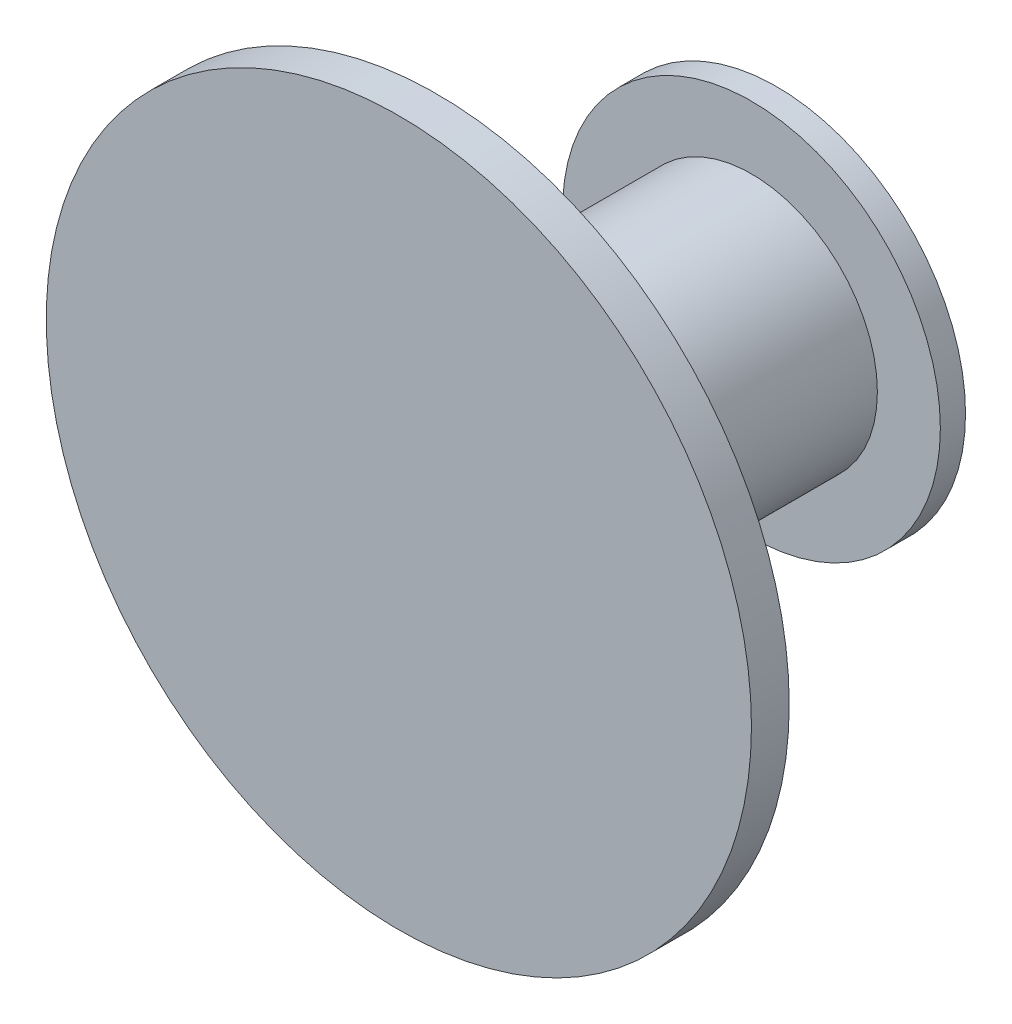
ISO-10303-21;
HEADER;
FILE_DESCRIPTION(('STEP AP214'),'2;1');
FILE_NAME('part.step','',(''),(''),'','','');
FILE_SCHEMA(('AUTOMOTIVE_DESIGN { 1 0 10303 214 1 1 1 1 }'));
ENDSEC;
DATA;
#1=APPLICATION_CONTEXT('core data for automotive mechanical design processes');
#2=APPLICATION_PROTOCOL_DEFINITION('international standard','automotive_design',2000,#1);
#3=PRODUCT_CONTEXT('',#1,'mechanical');
#4=PRODUCT('Part','Part','',(#3));
#5=PRODUCT_RELATED_PRODUCT_CATEGORY('part','',(#4));
#6=PRODUCT_DEFINITION_FORMATION('','',#4);
#7=PRODUCT_DEFINITION_CONTEXT('part definition',#1,'design');
#8=PRODUCT_DEFINITION('design','',#6,#7);
#9=PRODUCT_DEFINITION_SHAPE('','',#8);
#10=(LENGTH_UNIT() NAMED_UNIT(*) SI_UNIT(.MILLI.,.METRE.));
#11=(NAMED_UNIT(*) PLANE_ANGLE_UNIT() SI_UNIT($,.RADIAN.));
#12=(NAMED_UNIT(*) SI_UNIT($,.STERADIAN.) SOLID_ANGLE_UNIT());
#13=UNCERTAINTY_MEASURE_WITH_UNIT(LENGTH_MEASURE(1.E-05),#10,'distance_accuracy_value','');
#14=(GEOMETRIC_REPRESENTATION_CONTEXT(3) GLOBAL_UNCERTAINTY_ASSIGNED_CONTEXT((#13)) GLOBAL_UNIT_ASSIGNED_CONTEXT((#10,
#11,#12)) REPRESENTATION_CONTEXT('',''));
#15=CARTESIAN_POINT('',(0.,0.,0.));
#16=DIRECTION('',(0.,0.,1.));
#17=DIRECTION('',(1.,0.,0.));
#18=AXIS2_PLACEMENT_3D('',#15,#16,#17);
#19=CARTESIAN_POINT('',(0.,0.,20.));
#20=DIRECTION('',(0.,0.,-1.));
#21=DIRECTION('',(-1.,0.,0.));
#22=AXIS2_PLACEMENT_3D('',#19,#20,#21);
#23=CYLINDRICAL_SURFACE('',#22,150.);
#24=CARTESIAN_POINT('',(0.,0.,20.));
#25=DIRECTION('',(0.,0.,1.));
#26=DIRECTION('',(1.,0.,0.));
#27=AXIS2_PLACEMENT_3D('',#24,#25,#26);
#28=CIRCLE('',#27,150.);
#29=CARTESIAN_POINT('',(150.,0.,20.));
#30=VERTEX_POINT('',#29);
#31=EDGE_CURVE('E45',#30,#30,#28,.T.);
#32=ORIENTED_EDGE('',*,*,#31,.F.);
#33=EDGE_LOOP('',(#32));
#34=FACE_BOUND('',#33,.T.);
#35=CARTESIAN_POINT('',(0.,0.,0.));
#36=DIRECTION('',(0.,0.,1.));
#37=DIRECTION('',(1.,0.,0.));
#38=AXIS2_PLACEMENT_3D('',#35,#36,#37);
#39=CIRCLE('',#38,150.);
#40=CARTESIAN_POINT('',(150.,0.,0.));
#41=VERTEX_POINT('',#40);
#42=EDGE_CURVE('E40',#41,#41,#39,.T.);
#43=ORIENTED_EDGE('',*,*,#42,.T.);
#44=EDGE_LOOP('',(#43));
#45=FACE_BOUND('',#44,.T.);
#46=ADVANCED_FACE('F37',(#34,#45),#23,.T.);
#47=CARTESIAN_POINT('',(0.,0.,20.));
#48=DIRECTION('',(0.,0.,1.));
#49=DIRECTION('',(1.,0.,0.));
#50=AXIS2_PLACEMENT_3D('',#47,#48,#49);
#51=PLANE('',#50);
#52=CARTESIAN_POINT('',(0.,0.,20.));
#53=DIRECTION('',(0.,0.,1.));
#54=DIRECTION('',(1.,0.,0.));
#55=AXIS2_PLACEMENT_3D('',#52,#53,#54);
#56=CIRCLE('',#55,100.);
#57=CARTESIAN_POINT('',(100.,0.,20.));
#58=VERTEX_POINT('',#57);
#59=EDGE_CURVE('E10',#58,#58,#56,.T.);
#60=ORIENTED_EDGE('',*,*,#59,.F.);
#61=EDGE_LOOP('',(#60));
#62=FACE_BOUND('',#61,.T.);
#63=ORIENTED_EDGE('',*,*,#31,.T.);
#64=EDGE_LOOP('',(#63));
#65=FACE_BOUND('',#64,.T.);
#66=ADVANCED_FACE('F83',(#62,#65),#51,.T.);
#67=CARTESIAN_POINT('',(0.,0.,0.));
#68=DIRECTION('',(0.,0.,1.));
#69=DIRECTION('',(1.,0.,0.));
#70=AXIS2_PLACEMENT_3D('',#67,#68,#69);
#71=PLANE('',#70);
#72=ORIENTED_EDGE('',*,*,#42,.F.);
#73=EDGE_LOOP('',(#72));
#74=FACE_BOUND('',#73,.T.);
#75=ADVANCED_FACE('F88',(#74),#71,.F.);
#76=CARTESIAN_POINT('',(0.,0.,270.));
#77=DIRECTION('',(0.,0.,-1.));
#78=DIRECTION('',(-1.,0.,0.));
#79=AXIS2_PLACEMENT_3D('',#76,#77,#78);
#80=CYLINDRICAL_SURFACE('',#79,100.);
#81=CARTESIAN_POINT('',(0.,0.,270.));
#82=DIRECTION('',(0.,0.,1.));
#83=DIRECTION('',(1.,0.,0.));
#84=AXIS2_PLACEMENT_3D('',#81,#82,#83);
#85=CIRCLE('',#84,100.);
#86=CARTESIAN_POINT('',(100.,0.,270.));
#87=VERTEX_POINT('',#86);
#88=EDGE_CURVE('E52',#87,#87,#85,.T.);
#89=ORIENTED_EDGE('',*,*,#88,.F.);
#90=EDGE_LOOP('',(#89));
#91=FACE_BOUND('',#90,.T.);
#92=ORIENTED_EDGE('',*,*,#59,.T.);
#93=EDGE_LOOP('',(#92));
#94=FACE_BOUND('',#93,.T.);
#95=ADVANCED_FACE('F70',(#91,#94),#80,.T.);
#96=CARTESIAN_POINT('',(0.,0.,300.));
#97=DIRECTION('',(0.,0.,-1.));
#98=DIRECTION('',(-1.,0.,0.));
#99=AXIS2_PLACEMENT_3D('',#96,#97,#98);
#100=CYLINDRICAL_SURFACE('',#99,280.);
#101=CARTESIAN_POINT('',(0.,0.,300.));
#102=DIRECTION('',(0.,0.,1.));
#103=DIRECTION('',(1.,0.,0.));
#104=AXIS2_PLACEMENT_3D('',#101,#102,#103);
#105=CIRCLE('',#104,280.);
#106=CARTESIAN_POINT('',(280.,0.,300.));
#107=VERTEX_POINT('',#106);
#108=EDGE_CURVE('E56',#107,#107,#105,.T.);
#109=ORIENTED_EDGE('',*,*,#108,.F.);
#110=EDGE_LOOP('',(#109));
#111=FACE_BOUND('',#110,.T.);
#112=CARTESIAN_POINT('',(0.,0.,270.));
#113=DIRECTION('',(0.,0.,1.));
#114=DIRECTION('',(1.,0.,0.));
#115=AXIS2_PLACEMENT_3D('',#112,#113,#114);
#116=CIRCLE('',#115,280.);
#117=CARTESIAN_POINT('',(280.,0.,270.));
#118=VERTEX_POINT('',#117);
#119=EDGE_CURVE('E57',#118,#118,#116,.T.);
#120=ORIENTED_EDGE('',*,*,#119,.T.);
#121=EDGE_LOOP('',(#120));
#122=FACE_BOUND('',#121,.T.);
#123=ADVANCED_FACE('F67',(#111,#122),#100,.T.);
#124=CARTESIAN_POINT('',(0.,0.,300.));
#125=DIRECTION('',(0.,0.,1.));
#126=DIRECTION('',(1.,0.,0.));
#127=AXIS2_PLACEMENT_3D('',#124,#125,#126);
#128=PLANE('',#127);
#129=ORIENTED_EDGE('',*,*,#108,.T.);
#130=EDGE_LOOP('',(#129));
#131=FACE_BOUND('',#130,.T.);
#132=ADVANCED_FACE('F65',(#131),#128,.T.);
#133=CARTESIAN_POINT('',(0.,0.,270.));
#134=DIRECTION('',(0.,0.,1.));
#135=DIRECTION('',(1.,0.,0.));
#136=AXIS2_PLACEMENT_3D('',#133,#134,#135);
#137=PLANE('',#136);
#138=ORIENTED_EDGE('',*,*,#88,.T.);
#139=EDGE_LOOP('',(#138));
#140=FACE_BOUND('',#139,.T.);
#141=ORIENTED_EDGE('',*,*,#119,.F.);
#142=EDGE_LOOP('',(#141));
#143=FACE_BOUND('',#142,.T.);
#144=ADVANCED_FACE('F74',(#140,#143),#137,.F.);
#145=CLOSED_SHELL('',(#46,#66,#75,#95,#123,#132,#144));
#146=MANIFOLD_SOLID_BREP('B2',#145);
#147=ADVANCED_BREP_SHAPE_REPRESENTATION('',(#18,#146),#14);
#148=SHAPE_DEFINITION_REPRESENTATION(#9,#147);
ENDSEC;
END-ISO-10303-21;
